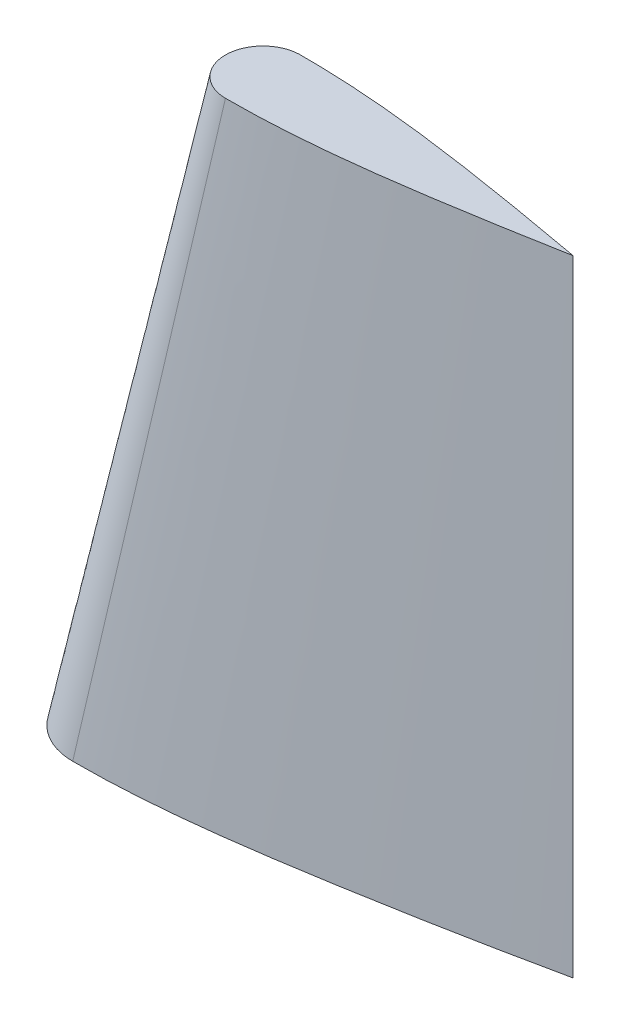
ISO-10303-21;
HEADER;
FILE_DESCRIPTION(('STEP AP214'),'2;1');
FILE_NAME('part.step','',(''),(''),'','','');
FILE_SCHEMA(('AUTOMOTIVE_DESIGN { 1 0 10303 214 1 1 1 1 }'));
ENDSEC;
DATA;
#1=APPLICATION_CONTEXT('core data for automotive mechanical design processes');
#2=APPLICATION_PROTOCOL_DEFINITION('international standard','automotive_design',2000,#1);
#3=PRODUCT_CONTEXT('',#1,'mechanical');
#4=PRODUCT('Part','Part','',(#3));
#5=PRODUCT_RELATED_PRODUCT_CATEGORY('part','',(#4));
#6=PRODUCT_DEFINITION_FORMATION('','',#4);
#7=PRODUCT_DEFINITION_CONTEXT('part definition',#1,'design');
#8=PRODUCT_DEFINITION('design','',#6,#7);
#9=PRODUCT_DEFINITION_SHAPE('','',#8);
#10=(LENGTH_UNIT() NAMED_UNIT(*) SI_UNIT(.MILLI.,.METRE.));
#11=(NAMED_UNIT(*) PLANE_ANGLE_UNIT() SI_UNIT($,.RADIAN.));
#12=(NAMED_UNIT(*) SI_UNIT($,.STERADIAN.) SOLID_ANGLE_UNIT());
#13=UNCERTAINTY_MEASURE_WITH_UNIT(LENGTH_MEASURE(1.E-05),#10,'distance_accuracy_value','');
#14=(GEOMETRIC_REPRESENTATION_CONTEXT(3) GLOBAL_UNCERTAINTY_ASSIGNED_CONTEXT((#13)) GLOBAL_UNIT_ASSIGNED_CONTEXT((#10,
#11,#12)) REPRESENTATION_CONTEXT('',''));
#15=CARTESIAN_POINT('',(0.,0.,0.));
#16=DIRECTION('',(0.,0.,1.));
#17=DIRECTION('',(1.,0.,0.));
#18=AXIS2_PLACEMENT_3D('',#15,#16,#17);
#19=CARTESIAN_POINT('',(15.4916966788492,0.,-4.31004482201036));
#20=DIRECTION('',(0.,-1.,0.));
#21=DIRECTION('',(0.,0.,-1.));
#22=AXIS2_PLACEMENT_3D('',#19,#20,#21);
#23=PLANE('',#22);
#24=CARTESIAN_POINT('',(40.,0.,0.));
#25=CARTESIAN_POINT('',(37.0445412677923,0.,-0.62964262137382));
#26=CARTESIAN_POINT('',(31.2276197299389,0.,-1.80349379930434));
#27=CARTESIAN_POINT('',(22.6086198443791,0.,-3.31984094373937));
#28=CARTESIAN_POINT('',(13.9512321521823,0.,-4.60421383377369));
#29=CARTESIAN_POINT('',(8.02177288456332,0.,-5.0086476905084));
#30=CARTESIAN_POINT('',(4.38087404909369,0.,-5.));
#31=CARTESIAN_POINT('',(3.11748439562177,0.,-4.76709327557003));
#32=CARTESIAN_POINT('',(1.43851583269903,0.,-3.69571817973716));
#33=CARTESIAN_POINT('',(0.277011648049916,0.,-2.02085771331407));
#34=CARTESIAN_POINT('',(-0.138912066287123,0.,0.));
#35=CARTESIAN_POINT('',(0.277011648049914,0.,2.02085771331406));
#36=CARTESIAN_POINT('',(1.43851583269904,0.,3.69571817973717));
#37=CARTESIAN_POINT('',(3.11748439562177,0.,4.76709327557003));
#38=CARTESIAN_POINT('',(4.38087404909368,0.,5.));
#39=CARTESIAN_POINT('',(5.,0.,5.));
#40=B_SPLINE_CURVE_WITH_KNOTS('',3,(#24,#25,#26,#27,#28,#29,#30,#31,#32,#33,#34,#35,#36,#37,#38,
#39),.UNSPECIFIED.,.F.,.F.,(4,1,1,1,2,1,1,1,1,1,1,1,4),(0.,0.177333273006561,0.354666546013123,
0.531999819019684,0.709333092026245,0.745666455522965,0.781999819019684,0.818333182516403,
0.854666546013123,0.890999909509842,0.927333273006561,0.963666636503281,1.),.UNSPECIFIED.);
#41=CARTESIAN_POINT('',(40.,0.,0.));
#42=VERTEX_POINT('',#41);
#43=CARTESIAN_POINT('',(5.,0.,5.));
#44=VERTEX_POINT('',#43);
#45=EDGE_CURVE('E55',#42,#44,#40,.T.);
#46=ORIENTED_EDGE('',*,*,#45,.F.);
#47=CARTESIAN_POINT('',(5.,0.,5.));
#48=CARTESIAN_POINT('',(7.94988911205808,0.,5.00844197398338));
#49=CARTESIAN_POINT('',(13.8405253119485,0.,4.61972002173335));
#50=CARTESIAN_POINT('',(22.623512626812,0.,3.3186470021521));
#51=CARTESIAN_POINT('',(31.329892251222,0.,1.78438891807088));
#52=CARTESIAN_POINT('',(37.1098034534298,0.,0.615738907140369));
#53=CARTESIAN_POINT('',(40.,0.,0.));
#54=B_SPLINE_CURVE_WITH_KNOTS('',3,(#47,#48,#49,#50,#51,#52,#53),.UNSPECIFIED.,.F.,.F.,(4,1,1,1,
4),(0.,0.25,0.5,0.75,1.),.UNSPECIFIED.);
#55=EDGE_CURVE('E61',#44,#42,#54,.T.);
#56=ORIENTED_EDGE('',*,*,#55,.F.);
#57=EDGE_LOOP('',(#46,#56));
#58=FACE_BOUND('',#57,.T.);
#59=ADVANCED_FACE('F45',(#58),#23,.T.);
#60=CARTESIAN_POINT('',(22.5264812229002,50.,-2.64284902673734));
#61=DIRECTION('',(0.,-1.,5.3455714974078E-13));
#62=DIRECTION('',(0.,-5.3455714974078E-13,-1.));
#63=AXIS2_PLACEMENT_3D('',#60,#61,#62);
#64=PLANE('',#63);
#65=CARTESIAN_POINT('',(40.,50.,-3.46086516886445E-13));
#66=CARTESIAN_POINT('',(37.9989940886992,50.,-0.371723273630548));
#67=CARTESIAN_POINT('',(33.9209241769643,50.,-1.09035707557362));
#68=CARTESIAN_POINT('',(27.6711989510825,49.9999999999999,-2.07869006285452));
#69=CARTESIAN_POINT('',(21.3853269117009,50.,-2.81881360084494));
#70=CARTESIAN_POINT('',(17.244907492047,50.,-3.00582337354868));
#71=CARTESIAN_POINT('',(14.7926803862736,50.,-2.99999895975636));
#72=CARTESIAN_POINT('',(13.9805249299661,50.,-2.82507035986799));
#73=CARTESIAN_POINT('',(12.9944669432852,49.9999999999999,-2.1349041732148));
#74=CARTESIAN_POINT('',(12.3564748123238,50.0000000000001,-1.14472243339244));
#75=CARTESIAN_POINT('',(12.1361893108088,49.9999999999999,-3.48028897367847E-13));
#76=CARTESIAN_POINT('',(12.3564748123238,50.,1.14472243339175));
#77=CARTESIAN_POINT('',(12.9944669432852,50.,2.13490417321411));
#78=CARTESIAN_POINT('',(13.9805249299661,50.0000000000001,2.8250703598673));
#79=CARTESIAN_POINT('',(14.7926803862736,50.,2.99999895975567));
#80=CARTESIAN_POINT('',(15.2096755825529,50.,2.99999895975567));
#81=B_SPLINE_CURVE_WITH_KNOTS('',3,(#65,#66,#67,#68,#69,#70,#71,#72,#73,#74,#75,#76,#77,#78,#79,
#80),.UNSPECIFIED.,.F.,.F.,(4,1,1,1,2,1,1,1,1,1,1,1,4),(0.,0.177333273006561,0.354666546013123,
0.531999819019684,0.709333092026245,0.745666455522965,0.781999819019684,0.818333182516403,
0.854666546013123,0.890999909509842,0.927333273006561,0.963666636503281,1.),.UNSPECIFIED.);
#82=CARTESIAN_POINT('',(15.2096755825529,50.,2.99999895975567));
#83=VERTEX_POINT('',#82);
#84=CARTESIAN_POINT('',(40.,50.,-3.46086516886445E-13));
#85=VERTEX_POINT('',#84);
#86=EDGE_CURVE('E12',#83,#85,#81,.F.);
#87=ORIENTED_EDGE('',*,*,#86,.F.);
#88=CARTESIAN_POINT('',(15.2096755825529,50.,2.99999895975567));
#89=CARTESIAN_POINT('',(17.2964031869021,50.,3.00597074360148));
#90=CARTESIAN_POINT('',(21.4576002250354,50.0000000000001,2.81009536914772));
#91=CARTESIAN_POINT('',(27.6734257797301,50.,2.07765938997394));
#92=CARTESIAN_POINT('',(33.8458600731498,50.,1.10259611053674));
#93=CARTESIAN_POINT('',(37.9508120654103,50.,0.380673961544339));
#94=CARTESIAN_POINT('',(40.,50.,-3.46086516886445E-13));
#95=B_SPLINE_CURVE_WITH_KNOTS('',3,(#88,#89,#90,#91,#92,#93,#94),.UNSPECIFIED.,.F.,.F.,(4,1,1,1,
4),(0.,0.25,0.5,0.75,1.),.UNSPECIFIED.);
#96=EDGE_CURVE('E68',#85,#83,#95,.F.);
#97=ORIENTED_EDGE('',*,*,#96,.F.);
#98=EDGE_LOOP('',(#87,#97));
#99=FACE_BOUND('',#98,.T.);
#100=ADVANCED_FACE('F47',(#99),#64,.F.);
#101=CARTESIAN_POINT('',(40.,0.,0.));
#102=CARTESIAN_POINT('',(40.,50.,-3.46086516886445E-13));
#103=CARTESIAN_POINT('',(37.0445412677923,0.,-0.62964262137382));
#104=CARTESIAN_POINT('',(37.9989940886992,50.,-0.371723273630548));
#105=CARTESIAN_POINT('',(31.2276197299389,0.,-1.80349379930434));
#106=CARTESIAN_POINT('',(33.9209241769643,50.,-1.09035707557362));
#107=CARTESIAN_POINT('',(22.6086198443791,0.,-3.31984094373937));
#108=CARTESIAN_POINT('',(27.6711989510825,49.9999999999999,-2.07869006285452));
#109=CARTESIAN_POINT('',(13.9512321521823,0.,-4.60421383377369));
#110=CARTESIAN_POINT('',(21.3853269117009,50.,-2.81881360084494));
#111=CARTESIAN_POINT('',(8.02177288456332,0.,-5.0086476905084));
#112=CARTESIAN_POINT('',(17.244907492047,50.,-3.00582337354868));
#113=CARTESIAN_POINT('',(4.38087404909369,0.,-5.));
#114=CARTESIAN_POINT('',(14.7926803862736,50.,-2.99999895975636));
#115=CARTESIAN_POINT('',(3.11748439562177,0.,-4.76709327557003));
#116=CARTESIAN_POINT('',(13.9805249299661,50.,-2.82507035986799));
#117=CARTESIAN_POINT('',(1.43851583269903,0.,-3.69571817973716));
#118=CARTESIAN_POINT('',(12.9944669432852,49.9999999999999,-2.1349041732148));
#119=CARTESIAN_POINT('',(0.277011648049916,0.,-2.02085771331407));
#120=CARTESIAN_POINT('',(12.3564748123238,50.0000000000001,-1.14472243339244));
#121=CARTESIAN_POINT('',(-0.138912066287123,0.,0.));
#122=CARTESIAN_POINT('',(12.1361893108088,49.9999999999999,-3.48028897367847E-13));
#123=CARTESIAN_POINT('',(0.277011648049914,0.,2.02085771331406));
#124=CARTESIAN_POINT('',(12.3564748123238,50.,1.14472243339175));
#125=CARTESIAN_POINT('',(1.43851583269904,0.,3.69571817973717));
#126=CARTESIAN_POINT('',(12.9944669432852,50.,2.13490417321411));
#127=CARTESIAN_POINT('',(3.11748439562177,0.,4.76709327557003));
#128=CARTESIAN_POINT('',(13.9805249299661,50.0000000000001,2.8250703598673));
#129=CARTESIAN_POINT('',(4.38087404909368,0.,5.));
#130=CARTESIAN_POINT('',(14.7926803862736,50.,2.99999895975567));
#131=CARTESIAN_POINT('',(5.,0.,5.));
#132=CARTESIAN_POINT('',(15.2096755825529,50.,2.99999895975567));
#133=B_SPLINE_SURFACE_WITH_KNOTS('',3,1,((#101,#102),(#103,#104),(#105,#106),(#107,#108),(#109,
#110),(#111,#112),(#113,#114),(#115,#116),(#117,#118),(#119,#120),(#121,#122),(#123,#124),(#125,
#126),(#127,#128),(#129,#130),(#131,#132)),.UNSPECIFIED.,.F.,.F.,.F.,(4,1,1,1,2,1,1,1,1,1,1,1,
4),(2,2),(0.,0.177333273006561,0.354666546013123,0.531999819019684,0.709333092026245,
0.745666455522965,0.781999819019684,0.818333182516403,0.854666546013123,0.890999909509842,
0.927333273006561,0.963666636503281,1.),(0.,1.),.UNSPECIFIED.);
#134=DIRECTION('',(-0.199911775684238,-0.979030989123017,0.0391612599335494));
#135=VECTOR('',#134,1.);
#136=CARTESIAN_POINT('',(10.1048377912765,25.,3.99999947987783));
#137=LINE('',#136,#135);
#138=EDGE_CURVE('E76',#83,#44,#137,.T.);
#139=DIRECTION('',(0.,1.,0.));
#140=VECTOR('',#139,1.);
#141=CARTESIAN_POINT('',(40.,25.,-1.73043258443222E-13));
#142=LINE('',#141,#140);
#143=EDGE_CURVE('E75',#42,#85,#142,.T.);
#144=ORIENTED_EDGE('',*,*,#45,.T.);
#145=ORIENTED_EDGE('',*,*,#138,.F.);
#146=ORIENTED_EDGE('',*,*,#86,.T.);
#147=ORIENTED_EDGE('',*,*,#143,.F.);
#148=EDGE_LOOP('',(#144,#145,#146,#147));
#149=FACE_BOUND('',#148,.T.);
#150=ADVANCED_FACE('F80',(#149),#133,.T.);
#151=CARTESIAN_POINT('',(5.,0.,5.));
#152=CARTESIAN_POINT('',(15.2096755825529,50.,2.99999895975567));
#153=CARTESIAN_POINT('',(7.94988911205808,0.,5.00844197398338));
#154=CARTESIAN_POINT('',(17.2964031869021,50.,3.00597074360148));
#155=CARTESIAN_POINT('',(13.8405253119485,0.,4.61972002173335));
#156=CARTESIAN_POINT('',(21.4576002250354,50.0000000000001,2.81009536914772));
#157=CARTESIAN_POINT('',(22.623512626812,0.,3.3186470021521));
#158=CARTESIAN_POINT('',(27.6734257797301,50.,2.07765938997394));
#159=CARTESIAN_POINT('',(31.329892251222,0.,1.78438891807088));
#160=CARTESIAN_POINT('',(33.8458600731498,50.,1.10259611053674));
#161=CARTESIAN_POINT('',(37.1098034534298,0.,0.615738907140369));
#162=CARTESIAN_POINT('',(37.9508120654103,50.,0.380673961544339));
#163=CARTESIAN_POINT('',(40.,0.,0.));
#164=CARTESIAN_POINT('',(40.,50.,-3.46086516886445E-13));
#165=B_SPLINE_SURFACE_WITH_KNOTS('',3,1,((#151,#152),(#153,#154),(#155,#156),(#157,#158),(#159,
#160),(#161,#162),(#163,#164)),.UNSPECIFIED.,.F.,.F.,.F.,(4,1,1,1,4),(2,2),(0.,0.25,0.5,0.75,
1.),(0.,1.),.UNSPECIFIED.);
#166=ORIENTED_EDGE('',*,*,#55,.T.);
#167=ORIENTED_EDGE('',*,*,#143,.T.);
#168=ORIENTED_EDGE('',*,*,#96,.T.);
#169=ORIENTED_EDGE('',*,*,#138,.T.);
#170=EDGE_LOOP('',(#166,#167,#168,#169));
#171=FACE_BOUND('',#170,.T.);
#172=ADVANCED_FACE('F74',(#171),#165,.T.);
#173=CLOSED_SHELL('',(#59,#100,#150,#172));
#174=MANIFOLD_SOLID_BREP('B2',#173);
#175=ADVANCED_BREP_SHAPE_REPRESENTATION('',(#18,#174),#14);
#176=SHAPE_DEFINITION_REPRESENTATION(#9,#175);
ENDSEC;
END-ISO-10303-21;
